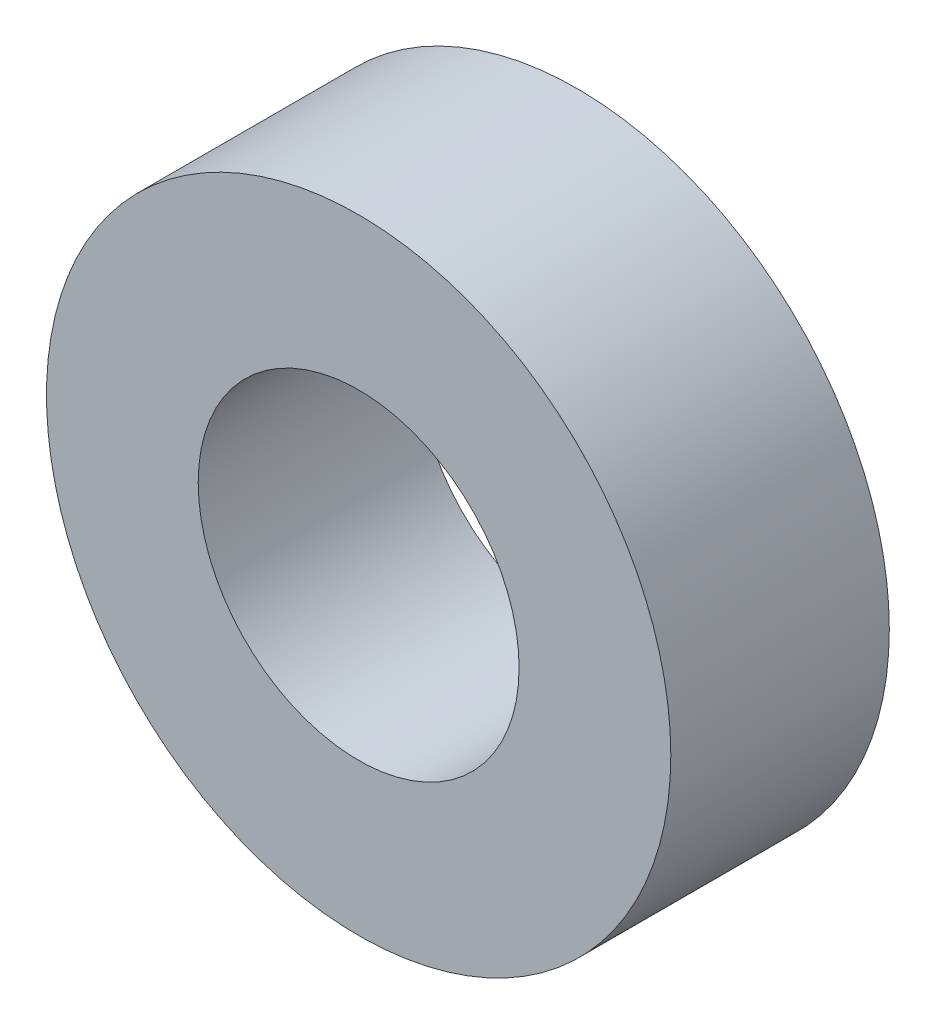
ISO-10303-21;
HEADER;
FILE_DESCRIPTION(('STEP AP214'),'2;1');
FILE_NAME('part.step','',(''),(''),'','','');
FILE_SCHEMA(('AUTOMOTIVE_DESIGN { 1 0 10303 214 1 1 1 1 }'));
ENDSEC;
DATA;
#1=APPLICATION_CONTEXT('core data for automotive mechanical design processes');
#2=APPLICATION_PROTOCOL_DEFINITION('international standard','automotive_design',2000,#1);
#3=PRODUCT_CONTEXT('',#1,'mechanical');
#4=PRODUCT('Part','Part','',(#3));
#5=PRODUCT_RELATED_PRODUCT_CATEGORY('part','',(#4));
#6=PRODUCT_DEFINITION_FORMATION('','',#4);
#7=PRODUCT_DEFINITION_CONTEXT('part definition',#1,'design');
#8=PRODUCT_DEFINITION('design','',#6,#7);
#9=PRODUCT_DEFINITION_SHAPE('','',#8);
#10=(LENGTH_UNIT() NAMED_UNIT(*) SI_UNIT(.MILLI.,.METRE.));
#11=(NAMED_UNIT(*) PLANE_ANGLE_UNIT() SI_UNIT($,.RADIAN.));
#12=(NAMED_UNIT(*) SI_UNIT($,.STERADIAN.) SOLID_ANGLE_UNIT());
#13=UNCERTAINTY_MEASURE_WITH_UNIT(LENGTH_MEASURE(1.E-05),#10,'distance_accuracy_value','');
#14=(GEOMETRIC_REPRESENTATION_CONTEXT(3) GLOBAL_UNCERTAINTY_ASSIGNED_CONTEXT((#13)) GLOBAL_UNIT_ASSIGNED_CONTEXT((#10,
#11,#12)) REPRESENTATION_CONTEXT('',''));
#15=CARTESIAN_POINT('',(0.,0.,0.));
#16=DIRECTION('',(0.,0.,1.));
#17=DIRECTION('',(1.,0.,0.));
#18=AXIS2_PLACEMENT_3D('',#15,#16,#17);
#19=CARTESIAN_POINT('',(0.,0.,4.445));
#20=DIRECTION('',(0.,0.,1.));
#21=DIRECTION('',(1.,0.,0.));
#22=AXIS2_PLACEMENT_3D('',#19,#20,#21);
#23=PLANE('',#22);
#24=CARTESIAN_POINT('',(0.,0.,4.445));
#25=DIRECTION('',(0.,0.,1.));
#26=DIRECTION('',(1.,0.,0.));
#27=AXIS2_PLACEMENT_3D('',#24,#25,#26);
#28=CIRCLE('',#27,6.35);
#29=CARTESIAN_POINT('',(6.35,0.,4.445));
#30=VERTEX_POINT('',#29);
#31=EDGE_CURVE('E10',#30,#30,#28,.T.);
#32=ORIENTED_EDGE('',*,*,#31,.T.);
#33=EDGE_LOOP('',(#32));
#34=FACE_BOUND('',#33,.T.);
#35=CARTESIAN_POINT('',(0.,0.,4.445));
#36=DIRECTION('',(0.,0.,1.));
#37=DIRECTION('',(1.,0.,0.));
#38=AXIS2_PLACEMENT_3D('',#35,#36,#37);
#39=CIRCLE('',#38,3.2639);
#40=CARTESIAN_POINT('',(3.2639,0.,4.445));
#41=VERTEX_POINT('',#40);
#42=EDGE_CURVE('E56',#41,#41,#39,.T.);
#43=ORIENTED_EDGE('',*,*,#42,.F.);
#44=EDGE_LOOP('',(#43));
#45=FACE_BOUND('',#44,.T.);
#46=ADVANCED_FACE('F43',(#34,#45),#23,.T.);
#47=CARTESIAN_POINT('',(0.,0.,0.));
#48=DIRECTION('',(0.,0.,1.));
#49=DIRECTION('',(1.,0.,0.));
#50=AXIS2_PLACEMENT_3D('',#47,#48,#49);
#51=PLANE('',#50);
#52=CARTESIAN_POINT('',(0.,0.,0.));
#53=DIRECTION('',(0.,0.,1.));
#54=DIRECTION('',(1.,0.,0.));
#55=AXIS2_PLACEMENT_3D('',#52,#53,#54);
#56=CIRCLE('',#55,6.35);
#57=CARTESIAN_POINT('',(6.35,0.,0.));
#58=VERTEX_POINT('',#57);
#59=EDGE_CURVE('E47',#58,#58,#56,.T.);
#60=ORIENTED_EDGE('',*,*,#59,.F.);
#61=EDGE_LOOP('',(#60));
#62=FACE_BOUND('',#61,.T.);
#63=CARTESIAN_POINT('',(0.,0.,0.));
#64=DIRECTION('',(0.,0.,1.));
#65=DIRECTION('',(1.,0.,0.));
#66=AXIS2_PLACEMENT_3D('',#63,#64,#65);
#67=CIRCLE('',#66,3.2639);
#68=CARTESIAN_POINT('',(3.2639,0.,0.));
#69=VERTEX_POINT('',#68);
#70=EDGE_CURVE('E58',#69,#69,#67,.T.);
#71=ORIENTED_EDGE('',*,*,#70,.T.);
#72=EDGE_LOOP('',(#71));
#73=FACE_BOUND('',#72,.T.);
#74=ADVANCED_FACE('F70',(#62,#73),#51,.F.);
#75=CARTESIAN_POINT('',(0.,0.,4.445));
#76=DIRECTION('',(0.,0.,-1.));
#77=DIRECTION('',(-1.,0.,0.));
#78=AXIS2_PLACEMENT_3D('',#75,#76,#77);
#79=CYLINDRICAL_SURFACE('',#78,6.35);
#80=ORIENTED_EDGE('',*,*,#31,.F.);
#81=EDGE_LOOP('',(#80));
#82=FACE_BOUND('',#81,.T.);
#83=ORIENTED_EDGE('',*,*,#59,.T.);
#84=EDGE_LOOP('',(#83));
#85=FACE_BOUND('',#84,.T.);
#86=ADVANCED_FACE('F45',(#82,#85),#79,.T.);
#87=CARTESIAN_POINT('',(0.,0.,4.445));
#88=DIRECTION('',(0.,0.,-1.));
#89=DIRECTION('',(-1.,0.,0.));
#90=AXIS2_PLACEMENT_3D('',#87,#88,#89);
#91=CYLINDRICAL_SURFACE('',#90,3.2639);
#92=ORIENTED_EDGE('',*,*,#42,.T.);
#93=EDGE_LOOP('',(#92));
#94=FACE_BOUND('',#93,.T.);
#95=ORIENTED_EDGE('',*,*,#70,.F.);
#96=EDGE_LOOP('',(#95));
#97=FACE_BOUND('',#96,.T.);
#98=ADVANCED_FACE('F66',(#94,#97),#91,.F.);
#99=CLOSED_SHELL('',(#46,#74,#86,#98));
#100=MANIFOLD_SOLID_BREP('B2',#99);
#101=ADVANCED_BREP_SHAPE_REPRESENTATION('',(#18,#100),#14);
#102=SHAPE_DEFINITION_REPRESENTATION(#9,#101);
ENDSEC;
END-ISO-10303-21;
